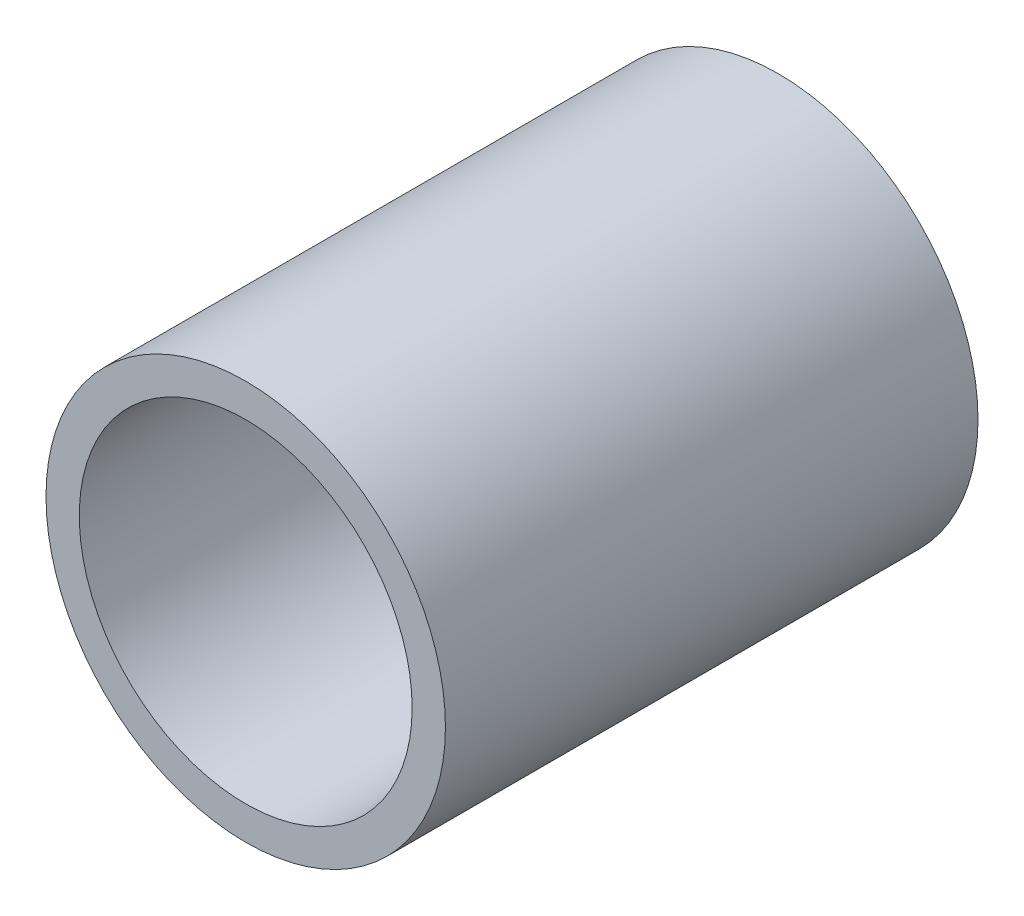
ISO-10303-21;
HEADER;
FILE_DESCRIPTION(('STEP AP214'),'2;1');
FILE_NAME('part.step','',(''),(''),'','','');
FILE_SCHEMA(('AUTOMOTIVE_DESIGN { 1 0 10303 214 1 1 1 1 }'));
ENDSEC;
DATA;
#1=APPLICATION_CONTEXT('core data for automotive mechanical design processes');
#2=APPLICATION_PROTOCOL_DEFINITION('international standard','automotive_design',2000,#1);
#3=PRODUCT_CONTEXT('',#1,'mechanical');
#4=PRODUCT('Part','Part','',(#3));
#5=PRODUCT_RELATED_PRODUCT_CATEGORY('part','',(#4));
#6=PRODUCT_DEFINITION_FORMATION('','',#4);
#7=PRODUCT_DEFINITION_CONTEXT('part definition',#1,'design');
#8=PRODUCT_DEFINITION('design','',#6,#7);
#9=PRODUCT_DEFINITION_SHAPE('','',#8);
#10=(LENGTH_UNIT() NAMED_UNIT(*) SI_UNIT(.MILLI.,.METRE.));
#11=(NAMED_UNIT(*) PLANE_ANGLE_UNIT() SI_UNIT($,.RADIAN.));
#12=(NAMED_UNIT(*) SI_UNIT($,.STERADIAN.) SOLID_ANGLE_UNIT());
#13=UNCERTAINTY_MEASURE_WITH_UNIT(LENGTH_MEASURE(1.E-05),#10,'distance_accuracy_value','');
#14=(GEOMETRIC_REPRESENTATION_CONTEXT(3) GLOBAL_UNCERTAINTY_ASSIGNED_CONTEXT((#13)) GLOBAL_UNIT_ASSIGNED_CONTEXT((#10,
#11,#12)) REPRESENTATION_CONTEXT('',''));
#15=CARTESIAN_POINT('',(0.,0.,0.));
#16=DIRECTION('',(0.,0.,1.));
#17=DIRECTION('',(1.,0.,0.));
#18=AXIS2_PLACEMENT_3D('',#15,#16,#17);
#19=CARTESIAN_POINT('',(0.,0.,40.));
#20=DIRECTION('',(0.,0.,-1.));
#21=DIRECTION('',(-1.,0.,0.));
#22=AXIS2_PLACEMENT_3D('',#19,#20,#21);
#23=CYLINDRICAL_SURFACE('',#22,15.);
#24=CARTESIAN_POINT('',(0.,0.,40.));
#25=DIRECTION('',(0.,0.,1.));
#26=DIRECTION('',(1.,0.,0.));
#27=AXIS2_PLACEMENT_3D('',#24,#25,#26);
#28=CIRCLE('',#27,15.);
#29=CARTESIAN_POINT('',(15.,0.,40.));
#30=VERTEX_POINT('',#29);
#31=EDGE_CURVE('E10',#30,#30,#28,.T.);
#32=ORIENTED_EDGE('',*,*,#31,.F.);
#33=EDGE_LOOP('',(#32));
#34=FACE_BOUND('',#33,.T.);
#35=CARTESIAN_POINT('',(0.,0.,0.));
#36=DIRECTION('',(0.,0.,1.));
#37=DIRECTION('',(1.,0.,0.));
#38=AXIS2_PLACEMENT_3D('',#35,#36,#37);
#39=CIRCLE('',#38,15.);
#40=CARTESIAN_POINT('',(15.,0.,0.));
#41=VERTEX_POINT('',#40);
#42=EDGE_CURVE('E38',#41,#41,#39,.T.);
#43=ORIENTED_EDGE('',*,*,#42,.T.);
#44=EDGE_LOOP('',(#43));
#45=FACE_BOUND('',#44,.T.);
#46=ADVANCED_FACE('F35',(#34,#45),#23,.T.);
#47=CARTESIAN_POINT('',(0.,0.,40.));
#48=DIRECTION('',(0.,0.,1.));
#49=DIRECTION('',(1.,0.,0.));
#50=AXIS2_PLACEMENT_3D('',#47,#48,#49);
#51=PLANE('',#50);
#52=CARTESIAN_POINT('',(0.,0.,40.));
#53=DIRECTION('',(0.,0.,1.));
#54=DIRECTION('',(1.,0.,0.));
#55=AXIS2_PLACEMENT_3D('',#52,#53,#54);
#56=CIRCLE('',#55,12.5);
#57=CARTESIAN_POINT('',(12.5,0.,40.));
#58=VERTEX_POINT('',#57);
#59=EDGE_CURVE('E47',#58,#58,#56,.T.);
#60=ORIENTED_EDGE('',*,*,#59,.F.);
#61=EDGE_LOOP('',(#60));
#62=FACE_BOUND('',#61,.T.);
#63=ORIENTED_EDGE('',*,*,#31,.T.);
#64=EDGE_LOOP('',(#63));
#65=FACE_BOUND('',#64,.T.);
#66=ADVANCED_FACE('F62',(#62,#65),#51,.T.);
#67=CARTESIAN_POINT('',(0.,0.,0.));
#68=DIRECTION('',(0.,0.,1.));
#69=DIRECTION('',(1.,0.,0.));
#70=AXIS2_PLACEMENT_3D('',#67,#68,#69);
#71=PLANE('',#70);
#72=CARTESIAN_POINT('',(0.,0.,0.));
#73=DIRECTION('',(0.,0.,1.));
#74=DIRECTION('',(1.,0.,0.));
#75=AXIS2_PLACEMENT_3D('',#72,#73,#74);
#76=CIRCLE('',#75,12.5);
#77=CARTESIAN_POINT('',(12.5,0.,0.));
#78=VERTEX_POINT('',#77);
#79=EDGE_CURVE('E45',#78,#78,#76,.T.);
#80=ORIENTED_EDGE('',*,*,#79,.T.);
#81=EDGE_LOOP('',(#80));
#82=FACE_BOUND('',#81,.T.);
#83=ORIENTED_EDGE('',*,*,#42,.F.);
#84=EDGE_LOOP('',(#83));
#85=FACE_BOUND('',#84,.T.);
#86=ADVANCED_FACE('F53',(#82,#85),#71,.F.);
#87=CARTESIAN_POINT('',(0.,0.,0.));
#88=DIRECTION('',(0.,0.,1.));
#89=DIRECTION('',(1.,0.,0.));
#90=AXIS2_PLACEMENT_3D('',#87,#88,#89);
#91=CYLINDRICAL_SURFACE('',#90,12.5);
#92=ORIENTED_EDGE('',*,*,#79,.F.);
#93=EDGE_LOOP('',(#92));
#94=FACE_BOUND('',#93,.T.);
#95=ORIENTED_EDGE('',*,*,#59,.T.);
#96=EDGE_LOOP('',(#95));
#97=FACE_BOUND('',#96,.T.);
#98=ADVANCED_FACE('F56',(#94,#97),#91,.F.);
#99=CLOSED_SHELL('',(#46,#66,#86,#98));
#100=MANIFOLD_SOLID_BREP('B2',#99);
#101=ADVANCED_BREP_SHAPE_REPRESENTATION('',(#18,#100),#14);
#102=SHAPE_DEFINITION_REPRESENTATION(#9,#101);
ENDSEC;
END-ISO-10303-21;
